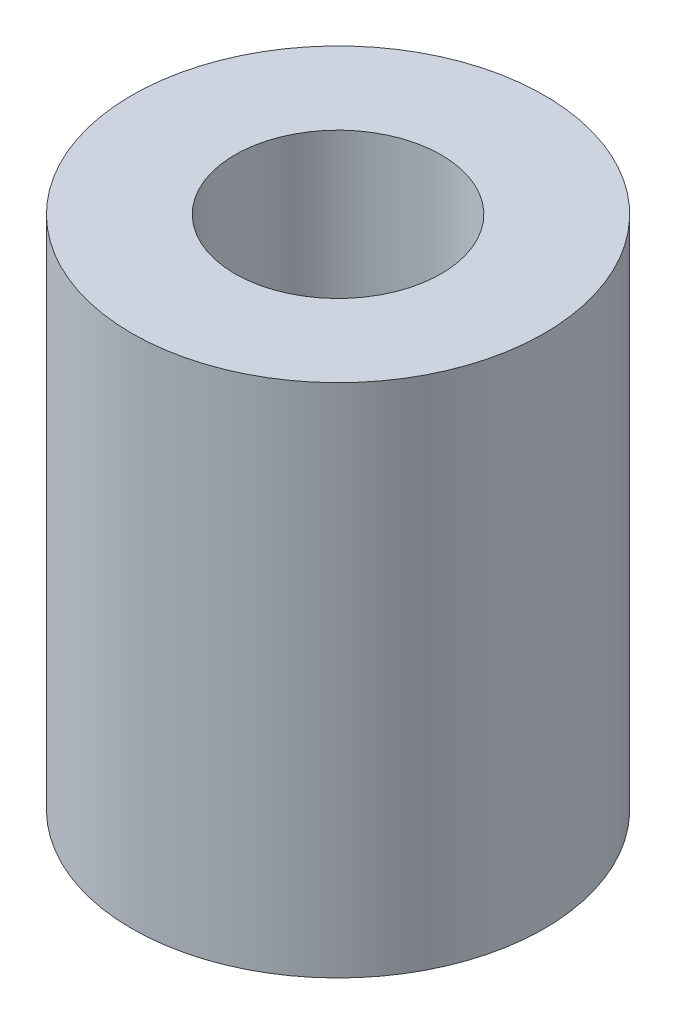
ISO-10303-21;
HEADER;
FILE_DESCRIPTION(('STEP AP214'),'2;1');
FILE_NAME('part.step','',(''),(''),'','','');
FILE_SCHEMA(('AUTOMOTIVE_DESIGN { 1 0 10303 214 1 1 1 1 }'));
ENDSEC;
DATA;
#1=APPLICATION_CONTEXT('core data for automotive mechanical design processes');
#2=APPLICATION_PROTOCOL_DEFINITION('international standard','automotive_design',2000,#1);
#3=PRODUCT_CONTEXT('',#1,'mechanical');
#4=PRODUCT('Part','Part','',(#3));
#5=PRODUCT_RELATED_PRODUCT_CATEGORY('part','',(#4));
#6=PRODUCT_DEFINITION_FORMATION('','',#4);
#7=PRODUCT_DEFINITION_CONTEXT('part definition',#1,'design');
#8=PRODUCT_DEFINITION('design','',#6,#7);
#9=PRODUCT_DEFINITION_SHAPE('','',#8);
#10=(LENGTH_UNIT() NAMED_UNIT(*) SI_UNIT(.MILLI.,.METRE.));
#11=(NAMED_UNIT(*) PLANE_ANGLE_UNIT() SI_UNIT($,.RADIAN.));
#12=(NAMED_UNIT(*) SI_UNIT($,.STERADIAN.) SOLID_ANGLE_UNIT());
#13=UNCERTAINTY_MEASURE_WITH_UNIT(LENGTH_MEASURE(1.E-05),#10,'distance_accuracy_value','');
#14=(GEOMETRIC_REPRESENTATION_CONTEXT(3) GLOBAL_UNCERTAINTY_ASSIGNED_CONTEXT((#13)) GLOBAL_UNIT_ASSIGNED_CONTEXT((#10,
#11,#12)) REPRESENTATION_CONTEXT('',''));
#15=CARTESIAN_POINT('',(0.,0.,0.));
#16=DIRECTION('',(0.,0.,1.));
#17=DIRECTION('',(1.,0.,0.));
#18=AXIS2_PLACEMENT_3D('',#15,#16,#17);
#19=CARTESIAN_POINT('',(0.,40.,0.));
#20=DIRECTION('',(0.,-1.,0.));
#21=DIRECTION('',(0.,0.,-1.));
#22=AXIS2_PLACEMENT_3D('',#19,#20,#21);
#23=CYLINDRICAL_SURFACE('',#22,16.);
#24=CARTESIAN_POINT('',(0.,40.,0.));
#25=DIRECTION('',(0.,1.,0.));
#26=DIRECTION('',(0.,0.,1.));
#27=AXIS2_PLACEMENT_3D('',#24,#25,#26);
#28=CIRCLE('',#27,16.);
#29=CARTESIAN_POINT('',(0.,40.,16.));
#30=VERTEX_POINT('',#29);
#31=EDGE_CURVE('E10',#30,#30,#28,.T.);
#32=ORIENTED_EDGE('',*,*,#31,.F.);
#33=EDGE_LOOP('',(#32));
#34=FACE_BOUND('',#33,.T.);
#35=CARTESIAN_POINT('',(0.,0.,0.));
#36=DIRECTION('',(0.,1.,0.));
#37=DIRECTION('',(0.,0.,1.));
#38=AXIS2_PLACEMENT_3D('',#35,#36,#37);
#39=CIRCLE('',#38,16.);
#40=CARTESIAN_POINT('',(0.,0.,16.));
#41=VERTEX_POINT('',#40);
#42=EDGE_CURVE('E45',#41,#41,#39,.T.);
#43=ORIENTED_EDGE('',*,*,#42,.T.);
#44=EDGE_LOOP('',(#43));
#45=FACE_BOUND('',#44,.T.);
#46=ADVANCED_FACE('F39',(#34,#45),#23,.T.);
#47=CARTESIAN_POINT('',(0.,40.,0.));
#48=DIRECTION('',(0.,1.,0.));
#49=DIRECTION('',(0.,0.,1.));
#50=AXIS2_PLACEMENT_3D('',#47,#48,#49);
#51=PLANE('',#50);
#52=CARTESIAN_POINT('',(0.,40.,0.));
#53=DIRECTION('',(0.,1.,0.));
#54=DIRECTION('',(0.,0.,1.));
#55=AXIS2_PLACEMENT_3D('',#52,#53,#54);
#56=CIRCLE('',#55,8.);
#57=CARTESIAN_POINT('',(0.,40.,8.));
#58=VERTEX_POINT('',#57);
#59=EDGE_CURVE('E51',#58,#58,#56,.T.);
#60=ORIENTED_EDGE('',*,*,#59,.F.);
#61=EDGE_LOOP('',(#60));
#62=FACE_BOUND('',#61,.T.);
#63=ORIENTED_EDGE('',*,*,#31,.T.);
#64=EDGE_LOOP('',(#63));
#65=FACE_BOUND('',#64,.T.);
#66=ADVANCED_FACE('F78',(#62,#65),#51,.T.);
#67=CARTESIAN_POINT('',(0.,0.,0.));
#68=DIRECTION('',(0.,1.,0.));
#69=DIRECTION('',(0.,0.,1.));
#70=AXIS2_PLACEMENT_3D('',#67,#68,#69);
#71=PLANE('',#70);
#72=CARTESIAN_POINT('',(0.,0.,0.));
#73=DIRECTION('',(0.,-1.,0.));
#74=DIRECTION('',(0.,0.,-1.));
#75=AXIS2_PLACEMENT_3D('',#72,#73,#74);
#76=CIRCLE('',#75,4.);
#77=CARTESIAN_POINT('',(0.,0.,-4.));
#78=VERTEX_POINT('',#77);
#79=EDGE_CURVE('E60',#78,#78,#76,.T.);
#80=ORIENTED_EDGE('',*,*,#79,.F.);
#81=EDGE_LOOP('',(#80));
#82=FACE_BOUND('',#81,.T.);
#83=ORIENTED_EDGE('',*,*,#42,.F.);
#84=EDGE_LOOP('',(#83));
#85=FACE_BOUND('',#84,.T.);
#86=ADVANCED_FACE('F75',(#82,#85),#71,.F.);
#87=CARTESIAN_POINT('',(0.,20.,0.));
#88=DIRECTION('',(0.,1.,0.));
#89=DIRECTION('',(0.,0.,1.));
#90=AXIS2_PLACEMENT_3D('',#87,#88,#89);
#91=CYLINDRICAL_SURFACE('',#90,8.);
#92=CARTESIAN_POINT('',(0.,20.,0.));
#93=DIRECTION('',(0.,1.,0.));
#94=DIRECTION('',(0.,0.,1.));
#95=AXIS2_PLACEMENT_3D('',#92,#93,#94);
#96=CIRCLE('',#95,8.);
#97=CARTESIAN_POINT('',(0.,20.,8.));
#98=VERTEX_POINT('',#97);
#99=EDGE_CURVE('E47',#98,#98,#96,.T.);
#100=ORIENTED_EDGE('',*,*,#99,.F.);
#101=EDGE_LOOP('',(#100));
#102=FACE_BOUND('',#101,.T.);
#103=ORIENTED_EDGE('',*,*,#59,.T.);
#104=EDGE_LOOP('',(#103));
#105=FACE_BOUND('',#104,.T.);
#106=ADVANCED_FACE('F73',(#102,#105),#91,.F.);
#107=CARTESIAN_POINT('',(0.,20.,0.));
#108=DIRECTION('',(0.,1.,0.));
#109=DIRECTION('',(0.,0.,1.));
#110=AXIS2_PLACEMENT_3D('',#107,#108,#109);
#111=PLANE('',#110);
#112=CARTESIAN_POINT('',(0.,20.,0.));
#113=DIRECTION('',(0.,-1.,0.));
#114=DIRECTION('',(0.,0.,-1.));
#115=AXIS2_PLACEMENT_3D('',#112,#113,#114);
#116=CIRCLE('',#115,4.);
#117=CARTESIAN_POINT('',(0.,20.,-4.));
#118=VERTEX_POINT('',#117);
#119=EDGE_CURVE('E53',#118,#118,#116,.T.);
#120=ORIENTED_EDGE('',*,*,#119,.T.);
#121=EDGE_LOOP('',(#120));
#122=FACE_BOUND('',#121,.T.);
#123=ORIENTED_EDGE('',*,*,#99,.T.);
#124=EDGE_LOOP('',(#123));
#125=FACE_BOUND('',#124,.T.);
#126=ADVANCED_FACE('F62',(#122,#125),#111,.T.);
#127=CARTESIAN_POINT('',(0.,20.,0.));
#128=DIRECTION('',(0.,-1.,0.));
#129=DIRECTION('',(0.,0.,-1.));
#130=AXIS2_PLACEMENT_3D('',#127,#128,#129);
#131=CYLINDRICAL_SURFACE('',#130,4.);
#132=ORIENTED_EDGE('',*,*,#119,.F.);
#133=EDGE_LOOP('',(#132));
#134=FACE_BOUND('',#133,.T.);
#135=ORIENTED_EDGE('',*,*,#79,.T.);
#136=EDGE_LOOP('',(#135));
#137=FACE_BOUND('',#136,.T.);
#138=ADVANCED_FACE('F66',(#134,#137),#131,.F.);
#139=CLOSED_SHELL('',(#46,#66,#86,#106,#126,#138));
#140=MANIFOLD_SOLID_BREP('B2',#139);
#141=ADVANCED_BREP_SHAPE_REPRESENTATION('',(#18,#140),#14);
#142=SHAPE_DEFINITION_REPRESENTATION(#9,#141);
ENDSEC;
END-ISO-10303-21;
